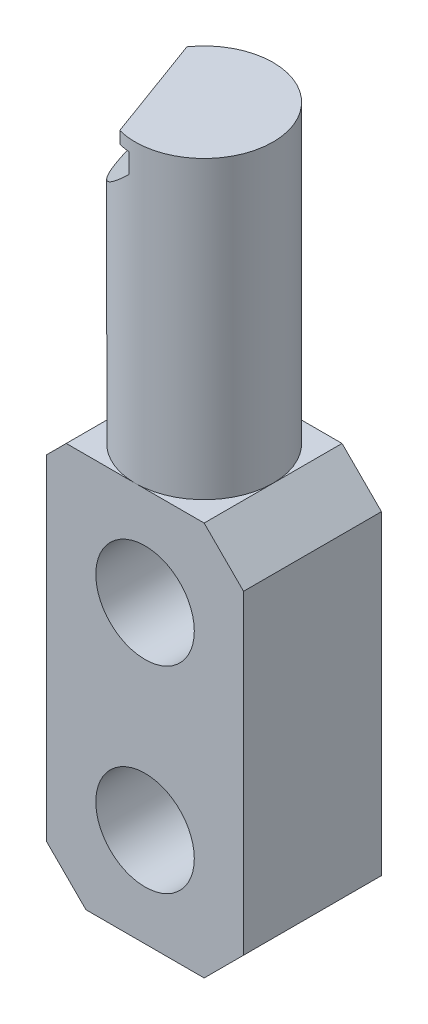
ISO-10303-21;
HEADER;
FILE_DESCRIPTION(('STEP AP214'),'2;1');
FILE_NAME('part.step','',(''),(''),'','','');
FILE_SCHEMA(('AUTOMOTIVE_DESIGN { 1 0 10303 214 1 1 1 1 }'));
ENDSEC;
DATA;
#1=APPLICATION_CONTEXT('core data for automotive mechanical design processes');
#2=APPLICATION_PROTOCOL_DEFINITION('international standard','automotive_design',2000,#1);
#3=PRODUCT_CONTEXT('',#1,'mechanical');
#4=PRODUCT('Part','Part','',(#3));
#5=PRODUCT_RELATED_PRODUCT_CATEGORY('part','',(#4));
#6=PRODUCT_DEFINITION_FORMATION('','',#4);
#7=PRODUCT_DEFINITION_CONTEXT('part definition',#1,'design');
#8=PRODUCT_DEFINITION('design','',#6,#7);
#9=PRODUCT_DEFINITION_SHAPE('','',#8);
#10=(LENGTH_UNIT() NAMED_UNIT(*) SI_UNIT(.MILLI.,.METRE.));
#11=(NAMED_UNIT(*) PLANE_ANGLE_UNIT() SI_UNIT($,.RADIAN.));
#12=(NAMED_UNIT(*) SI_UNIT($,.STERADIAN.) SOLID_ANGLE_UNIT());
#13=UNCERTAINTY_MEASURE_WITH_UNIT(LENGTH_MEASURE(1.E-05),#10,'distance_accuracy_value','');
#14=(GEOMETRIC_REPRESENTATION_CONTEXT(3) GLOBAL_UNCERTAINTY_ASSIGNED_CONTEXT((#13)) GLOBAL_UNIT_ASSIGNED_CONTEXT((#10,
#11,#12)) REPRESENTATION_CONTEXT('',''));
#15=CARTESIAN_POINT('',(0.,0.,0.));
#16=DIRECTION('',(0.,0.,1.));
#17=DIRECTION('',(1.,0.,0.));
#18=AXIS2_PLACEMENT_3D('',#15,#16,#17);
#19=CARTESIAN_POINT('',(0.,20.,7.));
#20=DIRECTION('',(0.,-1.,0.));
#21=DIRECTION('',(1.,0.,0.));
#22=AXIS2_PLACEMENT_3D('',#19,#20,#21);
#23=PLANE('',#22);
#24=DIRECTION('',(-1.,0.,0.));
#25=VECTOR('',#24,1.);
#26=CARTESIAN_POINT('',(0.,20.,0.));
#27=LINE('',#26,#25);
#28=CARTESIAN_POINT('',(4.5,20.,0.));
#29=VERTEX_POINT('',#28);
#30=CARTESIAN_POINT('',(1.00000000000001,20.,0.));
#31=VERTEX_POINT('',#30);
#32=EDGE_CURVE('E214',#29,#31,#27,.T.);
#33=ORIENTED_EDGE('',*,*,#32,.T.);
#34=DIRECTION('',(0.,0.,1.));
#35=VECTOR('',#34,1.);
#36=CARTESIAN_POINT('',(1.00000000000001,20.,7.));
#37=LINE('',#36,#35);
#38=CARTESIAN_POINT('',(1.00000000000001,20.,3.5));
#39=VERTEX_POINT('',#38);
#40=EDGE_CURVE('E47',#31,#39,#37,.T.);
#41=ORIENTED_EDGE('',*,*,#40,.T.);
#42=CARTESIAN_POINT('',(4.5,20.,3.5));
#43=DIRECTION('',(0.,1.,0.));
#44=DIRECTION('',(-1.,0.,0.));
#45=AXIS2_PLACEMENT_3D('',#42,#43,#44);
#46=CIRCLE('',#45,3.5);
#47=EDGE_CURVE('E193',#29,#39,#46,.T.);
#48=ORIENTED_EDGE('',*,*,#47,.F.);
#49=EDGE_LOOP('',(#33,#41,#48));
#50=FACE_BOUND('',#49,.T.);
#51=ADVANCED_FACE('F39',(#50),#23,.F.);
#52=DIRECTION('',(-1.,0.,0.));
#53=VECTOR('',#52,1.);
#54=CARTESIAN_POINT('',(0.,20.,7.));
#55=LINE('',#54,#53);
#56=CARTESIAN_POINT('',(8.,20.,7.));
#57=VERTEX_POINT('',#56);
#58=CARTESIAN_POINT('',(4.5,20.,7.));
#59=VERTEX_POINT('',#58);
#60=EDGE_CURVE('E204',#57,#59,#55,.T.);
#61=ORIENTED_EDGE('',*,*,#60,.F.);
#62=DIRECTION('',(0.,0.,-1.));
#63=VECTOR('',#62,1.);
#64=CARTESIAN_POINT('',(8.,20.,7.));
#65=LINE('',#64,#63);
#66=CARTESIAN_POINT('',(8.,20.,3.5));
#67=VERTEX_POINT('',#66);
#68=EDGE_CURVE('E252',#57,#67,#65,.T.);
#69=ORIENTED_EDGE('',*,*,#68,.T.);
#70=EDGE_CURVE('E189',#59,#67,#46,.T.);
#71=ORIENTED_EDGE('',*,*,#70,.F.);
#72=EDGE_LOOP('',(#61,#69,#71));
#73=FACE_BOUND('',#72,.T.);
#74=ADVANCED_FACE('F301',(#73),#23,.F.);
#75=CARTESIAN_POINT('',(4.5,35.,3.5));
#76=DIRECTION('',(0.,-1.,0.));
#77=DIRECTION('',(1.,0.,0.));
#78=AXIS2_PLACEMENT_3D('',#75,#76,#77);
#79=CYLINDRICAL_SURFACE('',#78,3.5);
#80=ORIENTED_EDGE('',*,*,#70,.T.);
#81=EDGE_CURVE('E184',#67,#29,#46,.T.);
#82=ORIENTED_EDGE('',*,*,#81,.T.);
#83=ORIENTED_EDGE('',*,*,#47,.T.);
#84=EDGE_CURVE('E192',#39,#59,#46,.T.);
#85=ORIENTED_EDGE('',*,*,#84,.T.);
#86=EDGE_LOOP('',(#80,#82,#83,#85));
#87=FACE_BOUND('',#86,.T.);
#88=CARTESIAN_POINT('',(4.5,35.0192767521373,3.5));
#89=DIRECTION('',(-0.686678363662965,0.681998360062494,0.251696368168514));
#90=DIRECTION('',(-0.640337933440032,-0.731353701619174,0.234710660443196));
#91=AXIS2_PLACEMENT_3D('',#88,#89,#90);
#92=ELLIPSE('',#91,5.13197714973872,3.5);
#93=CARTESIAN_POINT('',(1.99557656692745,33.4,1.05503307427748));
#94=VERTEX_POINT('',#93);
#95=CARTESIAN_POINT('',(4.16890259866514,33.4,6.98430402101041));
#96=VERTEX_POINT('',#95);
#97=EDGE_CURVE('E219',#94,#96,#92,.T.);
#98=ORIENTED_EDGE('',*,*,#97,.F.);
#99=DIRECTION('',(0.,-1.,0.));
#100=VECTOR('',#99,1.);
#101=CARTESIAN_POINT('',(1.99557656692745,35.,1.05503307427747));
#102=LINE('',#101,#100);
#103=CARTESIAN_POINT('',(1.99557656692745,34.4,1.05503307427747));
#104=VERTEX_POINT('',#103);
#105=EDGE_CURVE('E221',#104,#94,#102,.T.);
#106=ORIENTED_EDGE('',*,*,#105,.F.);
#107=CARTESIAN_POINT('',(4.5,34.4,3.5));
#108=DIRECTION('',(0.,-1.,0.));
#109=DIRECTION('',(0.,0.,-1.));
#110=AXIS2_PLACEMENT_3D('',#107,#108,#109);
#111=CIRCLE('',#110,3.5);
#112=CARTESIAN_POINT('',(1.62668825833074,34.4,1.50148063927678));
#113=VERTEX_POINT('',#112);
#114=EDGE_CURVE('E155',#113,#104,#111,.T.);
#115=ORIENTED_EDGE('',*,*,#114,.F.);
#116=DIRECTION('',(0.,-1.,0.));
#117=VECTOR('',#116,1.);
#118=CARTESIAN_POINT('',(1.62668825833074,35.,1.50148063927678));
#119=LINE('',#118,#117);
#120=CARTESIAN_POINT('',(1.62668825833074,35.,1.50148063927678));
#121=VERTEX_POINT('',#120);
#122=EDGE_CURVE('E161',#121,#113,#119,.T.);
#123=ORIENTED_EDGE('',*,*,#122,.F.);
#124=CARTESIAN_POINT('',(4.5,35.,3.5));
#125=DIRECTION('',(0.,1.,0.));
#126=DIRECTION('',(-1.,0.,0.));
#127=AXIS2_PLACEMENT_3D('',#124,#125,#126);
#128=CIRCLE('',#127,3.5);
#129=CARTESIAN_POINT('',(3.59887672368323,35.,6.88200781206669));
#130=VERTEX_POINT('',#129);
#131=EDGE_CURVE('E166',#130,#121,#128,.T.);
#132=ORIENTED_EDGE('',*,*,#131,.F.);
#133=DIRECTION('',(0.,-1.,0.));
#134=VECTOR('',#133,1.);
#135=CARTESIAN_POINT('',(3.59887672368323,35.,6.88200781206669));
#136=LINE('',#135,#134);
#137=CARTESIAN_POINT('',(3.59887672368323,34.4,6.88200781206669));
#138=VERTEX_POINT('',#137);
#139=EDGE_CURVE('E158',#138,#130,#136,.F.);
#140=ORIENTED_EDGE('',*,*,#139,.F.);
#141=CARTESIAN_POINT('',(4.16890259866514,34.4,6.98430402101041));
#142=VERTEX_POINT('',#141);
#143=EDGE_CURVE('E142',#142,#138,#111,.T.);
#144=ORIENTED_EDGE('',*,*,#143,.F.);
#145=DIRECTION('',(0.,-1.,0.));
#146=VECTOR('',#145,1.);
#147=CARTESIAN_POINT('',(4.16890259866514,35.,6.98430402101041));
#148=LINE('',#147,#146);
#149=EDGE_CURVE('E152',#96,#142,#148,.F.);
#150=ORIENTED_EDGE('',*,*,#149,.F.);
#151=EDGE_LOOP('',(#98,#106,#115,#123,#132,#140,#144,#150));
#152=FACE_BOUND('',#151,.T.);
#153=ADVANCED_FACE('F164',(#87,#152),#79,.T.);
#154=CARTESIAN_POINT('',(4.5,35.,3.5));
#155=DIRECTION('',(0.,1.,0.));
#156=DIRECTION('',(-1.,0.,0.));
#157=AXIS2_PLACEMENT_3D('',#154,#155,#156);
#158=PLANE('',#157);
#159=ORIENTED_EDGE('',*,*,#131,.T.);
#160=DIRECTION('',(0.34415135605559,0.,0.938914183578616));
#161=VECTOR('',#160,1.);
#162=CARTESIAN_POINT('',(2.61278249100699,35.,4.19174422567174));
#163=LINE('',#162,#161);
#164=EDGE_CURVE('E153',#121,#130,#163,.T.);
#165=ORIENTED_EDGE('',*,*,#164,.T.);
#166=EDGE_LOOP('',(#159,#165));
#167=FACE_BOUND('',#166,.T.);
#168=ADVANCED_FACE('F314',(#167),#158,.T.);
#169=ORIENTED_EDGE('',*,*,#81,.F.);
#170=DIRECTION('',(0.,0.,-1.));
#171=VECTOR('',#170,1.);
#172=CARTESIAN_POINT('',(8.,20.,7.));
#173=LINE('',#172,#171);
#174=CARTESIAN_POINT('',(8.,20.,0.));
#175=VERTEX_POINT('',#174);
#176=EDGE_CURVE('E250',#67,#175,#173,.T.);
#177=ORIENTED_EDGE('',*,*,#176,.T.);
#178=EDGE_CURVE('E197',#175,#29,#27,.T.);
#179=ORIENTED_EDGE('',*,*,#178,.T.);
#180=EDGE_LOOP('',(#169,#177,#179));
#181=FACE_BOUND('',#180,.T.);
#182=ADVANCED_FACE('F306',(#181),#23,.F.);
#183=ORIENTED_EDGE('',*,*,#84,.F.);
#184=DIRECTION('',(0.,0.,1.));
#185=VECTOR('',#184,1.);
#186=CARTESIAN_POINT('',(1.00000000000001,20.,7.));
#187=LINE('',#186,#185);
#188=CARTESIAN_POINT('',(1.00000000000001,20.,7.));
#189=VERTEX_POINT('',#188);
#190=EDGE_CURVE('E54',#39,#189,#187,.T.);
#191=ORIENTED_EDGE('',*,*,#190,.T.);
#192=EDGE_CURVE('E203',#59,#189,#55,.T.);
#193=ORIENTED_EDGE('',*,*,#192,.F.);
#194=EDGE_LOOP('',(#183,#191,#193));
#195=FACE_BOUND('',#194,.T.);
#196=ADVANCED_FACE('F304',(#195),#23,.F.);
#197=CARTESIAN_POINT('',(0.,0.,7.));
#198=DIRECTION('',(1.,0.,0.));
#199=DIRECTION('',(0.,0.,-1.));
#200=AXIS2_PLACEMENT_3D('',#197,#198,#199);
#201=PLANE('',#200);
#202=DIRECTION('',(0.,-1.,0.));
#203=VECTOR('',#202,1.);
#204=CARTESIAN_POINT('',(0.,0.,7.));
#205=LINE('',#204,#203);
#206=CARTESIAN_POINT('',(0.,19.,7.));
#207=VERTEX_POINT('',#206);
#208=CARTESIAN_POINT('',(0.,2.00000000000001,7.));
#209=VERTEX_POINT('',#208);
#210=EDGE_CURVE('E194',#207,#209,#205,.T.);
#211=ORIENTED_EDGE('',*,*,#210,.F.);
#212=DIRECTION('',(0.,0.,-1.));
#213=VECTOR('',#212,1.);
#214=CARTESIAN_POINT('',(0.,19.,7.));
#215=LINE('',#214,#213);
#216=CARTESIAN_POINT('',(0.,19.,0.));
#217=VERTEX_POINT('',#216);
#218=EDGE_CURVE('E255',#207,#217,#215,.T.);
#219=ORIENTED_EDGE('',*,*,#218,.T.);
#220=DIRECTION('',(0.,-1.,0.));
#221=VECTOR('',#220,1.);
#222=CARTESIAN_POINT('',(0.,0.,0.));
#223=LINE('',#222,#221);
#224=CARTESIAN_POINT('',(0.,2.00000000000001,0.));
#225=VERTEX_POINT('',#224);
#226=EDGE_CURVE('E188',#217,#225,#223,.T.);
#227=ORIENTED_EDGE('',*,*,#226,.T.);
#228=DIRECTION('',(0.,0.,1.));
#229=VECTOR('',#228,1.);
#230=CARTESIAN_POINT('',(0.,2.00000000000001,7.));
#231=LINE('',#230,#229);
#232=EDGE_CURVE('E236',#225,#209,#231,.T.);
#233=ORIENTED_EDGE('',*,*,#232,.T.);
#234=EDGE_LOOP('',(#211,#219,#227,#233));
#235=FACE_BOUND('',#234,.T.);
#236=ADVANCED_FACE('F273',(#235),#201,.F.);
#237=CARTESIAN_POINT('',(0.,0.,7.));
#238=DIRECTION('',(0.,1.,0.));
#239=DIRECTION('',(0.,0.,1.));
#240=AXIS2_PLACEMENT_3D('',#237,#238,#239);
#241=PLANE('',#240);
#242=DIRECTION('',(1.,0.,0.));
#243=VECTOR('',#242,1.);
#244=CARTESIAN_POINT('',(0.,0.,7.));
#245=LINE('',#244,#243);
#246=CARTESIAN_POINT('',(2.,0.,7.));
#247=VERTEX_POINT('',#246);
#248=CARTESIAN_POINT('',(7.99999999999999,0.,7.));
#249=VERTEX_POINT('',#248);
#250=EDGE_CURVE('E196',#247,#249,#245,.T.);
#251=ORIENTED_EDGE('',*,*,#250,.F.);
#252=DIRECTION('',(0.,0.,-1.));
#253=VECTOR('',#252,1.);
#254=CARTESIAN_POINT('',(2.,0.,7.));
#255=LINE('',#254,#253);
#256=CARTESIAN_POINT('',(2.,0.,0.));
#257=VERTEX_POINT('',#256);
#258=EDGE_CURVE('E226',#247,#257,#255,.T.);
#259=ORIENTED_EDGE('',*,*,#258,.T.);
#260=DIRECTION('',(1.,0.,0.));
#261=VECTOR('',#260,1.);
#262=CARTESIAN_POINT('',(0.,0.,0.));
#263=LINE('',#262,#261);
#264=CARTESIAN_POINT('',(7.99999999999999,0.,0.));
#265=VERTEX_POINT('',#264);
#266=EDGE_CURVE('E208',#257,#265,#263,.T.);
#267=ORIENTED_EDGE('',*,*,#266,.T.);
#268=DIRECTION('',(0.,0.,1.));
#269=VECTOR('',#268,1.);
#270=CARTESIAN_POINT('',(7.99999999999999,0.,7.));
#271=LINE('',#270,#269);
#272=EDGE_CURVE('E224',#265,#249,#271,.T.);
#273=ORIENTED_EDGE('',*,*,#272,.T.);
#274=EDGE_LOOP('',(#251,#259,#267,#273));
#275=FACE_BOUND('',#274,.T.);
#276=ADVANCED_FACE('F282',(#275),#241,.F.);
#277=CARTESIAN_POINT('',(10.,0.,7.));
#278=DIRECTION('',(-1.,0.,0.));
#279=DIRECTION('',(0.,0.,1.));
#280=AXIS2_PLACEMENT_3D('',#277,#278,#279);
#281=PLANE('',#280);
#282=DIRECTION('',(0.,1.,0.));
#283=VECTOR('',#282,1.);
#284=CARTESIAN_POINT('',(10.,0.,7.));
#285=LINE('',#284,#283);
#286=CARTESIAN_POINT('',(10.,2.,7.));
#287=VERTEX_POINT('',#286);
#288=CARTESIAN_POINT('',(10.,18.,7.));
#289=VERTEX_POINT('',#288);
#290=EDGE_CURVE('E200',#287,#289,#285,.T.);
#291=ORIENTED_EDGE('',*,*,#290,.F.);
#292=DIRECTION('',(0.,0.,-1.));
#293=VECTOR('',#292,1.);
#294=CARTESIAN_POINT('',(10.,2.,7.));
#295=LINE('',#294,#293);
#296=CARTESIAN_POINT('',(10.,2.,0.));
#297=VERTEX_POINT('',#296);
#298=EDGE_CURVE('E247',#287,#297,#295,.T.);
#299=ORIENTED_EDGE('',*,*,#298,.T.);
#300=DIRECTION('',(0.,1.,0.));
#301=VECTOR('',#300,1.);
#302=CARTESIAN_POINT('',(10.,0.,0.));
#303=LINE('',#302,#301);
#304=CARTESIAN_POINT('',(10.,18.,0.));
#305=VERTEX_POINT('',#304);
#306=EDGE_CURVE('E211',#297,#305,#303,.T.);
#307=ORIENTED_EDGE('',*,*,#306,.T.);
#308=DIRECTION('',(0.,0.,1.));
#309=VECTOR('',#308,1.);
#310=CARTESIAN_POINT('',(10.,18.,7.));
#311=LINE('',#310,#309);
#312=EDGE_CURVE('E245',#305,#289,#311,.T.);
#313=ORIENTED_EDGE('',*,*,#312,.T.);
#314=EDGE_LOOP('',(#291,#299,#307,#313));
#315=FACE_BOUND('',#314,.T.);
#316=ADVANCED_FACE('F291',(#315),#281,.F.);
#317=CARTESIAN_POINT('',(0.,20.,7.));
#318=DIRECTION('',(0.,0.,-1.));
#319=DIRECTION('',(-1.,0.,0.));
#320=AXIS2_PLACEMENT_3D('',#317,#318,#319);
#321=PLANE('',#320);
#322=CARTESIAN_POINT('',(5.,5.,7.));
#323=DIRECTION('',(0.,0.,1.));
#324=DIRECTION('',(1.,0.,0.));
#325=AXIS2_PLACEMENT_3D('',#322,#323,#324);
#326=CIRCLE('',#325,2.5);
#327=CARTESIAN_POINT('',(7.5,5.,7.));
#328=VERTEX_POINT('',#327);
#329=EDGE_CURVE('E169',#328,#328,#326,.T.);
#330=ORIENTED_EDGE('',*,*,#329,.F.);
#331=EDGE_LOOP('',(#330));
#332=FACE_BOUND('',#331,.T.);
#333=CARTESIAN_POINT('',(5.,15.,7.));
#334=DIRECTION('',(0.,0.,1.));
#335=DIRECTION('',(1.,0.,0.));
#336=AXIS2_PLACEMENT_3D('',#333,#334,#335);
#337=CIRCLE('',#336,2.5);
#338=CARTESIAN_POINT('',(7.5,15.,7.));
#339=VERTEX_POINT('',#338);
#340=EDGE_CURVE('E178',#339,#339,#337,.T.);
#341=ORIENTED_EDGE('',*,*,#340,.F.);
#342=EDGE_LOOP('',(#341));
#343=FACE_BOUND('',#342,.T.);
#344=ORIENTED_EDGE('',*,*,#192,.T.);
#345=DIRECTION('',(0.707106781186549,0.707106781186546,0.));
#346=VECTOR('',#345,1.);
#347=CARTESIAN_POINT('',(0.,19.,7.));
#348=LINE('',#347,#346);
#349=EDGE_CURVE('E11',#189,#207,#348,.F.);
#350=ORIENTED_EDGE('',*,*,#349,.T.);
#351=ORIENTED_EDGE('',*,*,#210,.T.);
#352=DIRECTION('',(-0.707106781186546,0.707106781186549,0.));
#353=VECTOR('',#352,1.);
#354=CARTESIAN_POINT('',(2.,0.,7.));
#355=LINE('',#354,#353);
#356=EDGE_CURVE('E243',#209,#247,#355,.F.);
#357=ORIENTED_EDGE('',*,*,#356,.T.);
#358=ORIENTED_EDGE('',*,*,#250,.T.);
#359=DIRECTION('',(-0.707106781186549,-0.707106781186546,0.));
#360=VECTOR('',#359,1.);
#361=CARTESIAN_POINT('',(10.,2.,7.));
#362=LINE('',#361,#360);
#363=EDGE_CURVE('E241',#249,#287,#362,.F.);
#364=ORIENTED_EDGE('',*,*,#363,.T.);
#365=ORIENTED_EDGE('',*,*,#290,.T.);
#366=DIRECTION('',(0.707106781186546,-0.707106781186549,0.));
#367=VECTOR('',#366,1.);
#368=CARTESIAN_POINT('',(8.,20.,7.));
#369=LINE('',#368,#367);
#370=EDGE_CURVE('E239',#289,#57,#369,.F.);
#371=ORIENTED_EDGE('',*,*,#370,.T.);
#372=ORIENTED_EDGE('',*,*,#60,.T.);
#373=EDGE_LOOP('',(#344,#350,#351,#357,#358,#364,#365,#371,#372));
#374=FACE_BOUND('',#373,.T.);
#375=ADVANCED_FACE('F271',(#332,#343,#374),#321,.F.);
#376=CARTESIAN_POINT('',(0.,20.,0.));
#377=DIRECTION('',(0.,0.,-1.));
#378=DIRECTION('',(-1.,0.,0.));
#379=AXIS2_PLACEMENT_3D('',#376,#377,#378);
#380=PLANE('',#379);
#381=CARTESIAN_POINT('',(5.,5.,0.));
#382=DIRECTION('',(0.,0.,1.));
#383=DIRECTION('',(1.,0.,0.));
#384=AXIS2_PLACEMENT_3D('',#381,#382,#383);
#385=CIRCLE('',#384,2.5);
#386=CARTESIAN_POINT('',(7.5,5.,0.));
#387=VERTEX_POINT('',#386);
#388=EDGE_CURVE('E175',#387,#387,#385,.T.);
#389=ORIENTED_EDGE('',*,*,#388,.T.);
#390=EDGE_LOOP('',(#389));
#391=FACE_BOUND('',#390,.T.);
#392=CARTESIAN_POINT('',(5.,15.,0.));
#393=DIRECTION('',(0.,0.,1.));
#394=DIRECTION('',(1.,0.,0.));
#395=AXIS2_PLACEMENT_3D('',#392,#393,#394);
#396=CIRCLE('',#395,2.5);
#397=CARTESIAN_POINT('',(7.5,15.,0.));
#398=VERTEX_POINT('',#397);
#399=EDGE_CURVE('E181',#398,#398,#396,.T.);
#400=ORIENTED_EDGE('',*,*,#399,.T.);
#401=EDGE_LOOP('',(#400));
#402=FACE_BOUND('',#401,.T.);
#403=ORIENTED_EDGE('',*,*,#226,.F.);
#404=DIRECTION('',(-0.707106781186549,-0.707106781186546,0.));
#405=VECTOR('',#404,1.);
#406=CARTESIAN_POINT('',(0.500000000000002,19.5,0.));
#407=LINE('',#406,#405);
#408=EDGE_CURVE('E258',#217,#31,#407,.F.);
#409=ORIENTED_EDGE('',*,*,#408,.T.);
#410=ORIENTED_EDGE('',*,*,#32,.F.);
#411=ORIENTED_EDGE('',*,*,#178,.F.);
#412=DIRECTION('',(-0.707106781186546,0.707106781186549,0.));
#413=VECTOR('',#412,1.);
#414=CARTESIAN_POINT('',(4.00000000000001,24.,0.));
#415=LINE('',#414,#413);
#416=EDGE_CURVE('E229',#175,#305,#415,.F.);
#417=ORIENTED_EDGE('',*,*,#416,.T.);
#418=ORIENTED_EDGE('',*,*,#306,.F.);
#419=DIRECTION('',(0.707106781186549,0.707106781186546,0.));
#420=VECTOR('',#419,1.);
#421=CARTESIAN_POINT('',(14.,5.99999999999997,0.));
#422=LINE('',#421,#420);
#423=EDGE_CURVE('E231',#297,#265,#422,.F.);
#424=ORIENTED_EDGE('',*,*,#423,.T.);
#425=ORIENTED_EDGE('',*,*,#266,.F.);
#426=DIRECTION('',(0.707106781186546,-0.707106781186549,0.));
#427=VECTOR('',#426,1.);
#428=CARTESIAN_POINT('',(-9.,11.,0.));
#429=LINE('',#428,#427);
#430=EDGE_CURVE('E233',#257,#225,#429,.F.);
#431=ORIENTED_EDGE('',*,*,#430,.T.);
#432=EDGE_LOOP('',(#403,#409,#410,#411,#417,#418,#424,#425,#431));
#433=FACE_BOUND('',#432,.T.);
#434=ADVANCED_FACE('F263',(#391,#402,#433),#380,.T.);
#435=CARTESIAN_POINT('',(5.,15.,0.));
#436=DIRECTION('',(0.,0.,1.));
#437=DIRECTION('',(1.,0.,0.));
#438=AXIS2_PLACEMENT_3D('',#435,#436,#437);
#439=CYLINDRICAL_SURFACE('',#438,2.5);
#440=ORIENTED_EDGE('',*,*,#399,.F.);
#441=EDGE_LOOP('',(#440));
#442=FACE_BOUND('',#441,.T.);
#443=ORIENTED_EDGE('',*,*,#340,.T.);
#444=EDGE_LOOP('',(#443));
#445=FACE_BOUND('',#444,.T.);
#446=ADVANCED_FACE('F397',(#442,#445),#439,.F.);
#447=CARTESIAN_POINT('',(5.,5.,0.));
#448=DIRECTION('',(0.,0.,1.));
#449=DIRECTION('',(1.,0.,0.));
#450=AXIS2_PLACEMENT_3D('',#447,#448,#449);
#451=CYLINDRICAL_SURFACE('',#450,2.5);
#452=ORIENTED_EDGE('',*,*,#388,.F.);
#453=EDGE_LOOP('',(#452));
#454=FACE_BOUND('',#453,.T.);
#455=ORIENTED_EDGE('',*,*,#329,.T.);
#456=EDGE_LOOP('',(#455));
#457=FACE_BOUND('',#456,.T.);
#458=ADVANCED_FACE('F346',(#454,#457),#451,.F.);
#459=CARTESIAN_POINT('',(4.86461050335268,33.4,8.88233524432303));
#460=DIRECTION('',(-0.686678363662965,0.681998360062494,0.251696368168514));
#461=DIRECTION('',(-0.704684806285746,-0.709520488633006,0.));
#462=AXIS2_PLACEMENT_3D('',#459,#460,#461);
#463=PLANE('',#462);
#464=ORIENTED_EDGE('',*,*,#97,.T.);
#465=DIRECTION('',(-0.34415135605559,0.,-0.938914183578616));
#466=VECTOR('',#465,1.);
#467=CARTESIAN_POINT('',(4.86461050335268,33.4,8.88233524432303));
#468=LINE('',#467,#466);
#469=EDGE_CURVE('E167',#96,#94,#468,.T.);
#470=ORIENTED_EDGE('',*,*,#469,.T.);
#471=EDGE_LOOP('',(#464,#470));
#472=FACE_BOUND('',#471,.T.);
#473=ADVANCED_FACE('F340',(#472),#463,.T.);
#474=CARTESIAN_POINT('',(4.86461050335268,34.4,8.88233524432303));
#475=DIRECTION('',(-0.938914183578616,0.,0.34415135605559));
#476=DIRECTION('',(0.34415135605559,0.,0.938914183578616));
#477=AXIS2_PLACEMENT_3D('',#474,#475,#476);
#478=PLANE('',#477);
#479=ORIENTED_EDGE('',*,*,#105,.T.);
#480=ORIENTED_EDGE('',*,*,#469,.F.);
#481=ORIENTED_EDGE('',*,*,#149,.T.);
#482=DIRECTION('',(-0.34415135605559,0.,-0.938914183578616));
#483=VECTOR('',#482,1.);
#484=CARTESIAN_POINT('',(4.86461050335268,34.4,8.88233524432303));
#485=LINE('',#484,#483);
#486=EDGE_CURVE('E148',#142,#104,#485,.T.);
#487=ORIENTED_EDGE('',*,*,#486,.T.);
#488=EDGE_LOOP('',(#479,#480,#481,#487));
#489=FACE_BOUND('',#488,.T.);
#490=ADVANCED_FACE('F345',(#489),#478,.T.);
#491=CARTESIAN_POINT('',(4.39515341156338,34.4,9.05441092235083));
#492=DIRECTION('',(0.,-1.,0.));
#493=DIRECTION('',(0.,0.,-1.));
#494=AXIS2_PLACEMENT_3D('',#491,#492,#493);
#495=PLANE('',#494);
#496=ORIENTED_EDGE('',*,*,#143,.T.);
#497=DIRECTION('',(-0.34415135605559,0.,-0.938914183578616));
#498=VECTOR('',#497,1.);
#499=CARTESIAN_POINT('',(4.39515341156338,34.4,9.05441092235083));
#500=LINE('',#499,#498);
#501=EDGE_CURVE('E145',#138,#113,#500,.T.);
#502=ORIENTED_EDGE('',*,*,#501,.T.);
#503=ORIENTED_EDGE('',*,*,#114,.T.);
#504=ORIENTED_EDGE('',*,*,#486,.F.);
#505=EDGE_LOOP('',(#496,#502,#503,#504));
#506=FACE_BOUND('',#505,.T.);
#507=ADVANCED_FACE('F144',(#506),#495,.T.);
#508=CARTESIAN_POINT('',(4.39515341156338,35.,9.05441092235083));
#509=DIRECTION('',(-0.938914183578616,0.,0.34415135605559));
#510=DIRECTION('',(0.34415135605559,0.,0.938914183578616));
#511=AXIS2_PLACEMENT_3D('',#508,#509,#510);
#512=PLANE('',#511);
#513=ORIENTED_EDGE('',*,*,#122,.T.);
#514=ORIENTED_EDGE('',*,*,#501,.F.);
#515=ORIENTED_EDGE('',*,*,#139,.T.);
#516=ORIENTED_EDGE('',*,*,#164,.F.);
#517=EDGE_LOOP('',(#513,#514,#515,#516));
#518=FACE_BOUND('',#517,.T.);
#519=ADVANCED_FACE('F157',(#518),#512,.T.);
#520=CARTESIAN_POINT('',(2.,0.,7.));
#521=DIRECTION('',(0.707106781186549,0.707106781186546,0.));
#522=DIRECTION('',(-0.707106781186546,0.707106781186549,0.));
#523=AXIS2_PLACEMENT_3D('',#520,#521,#522);
#524=PLANE('',#523);
#525=ORIENTED_EDGE('',*,*,#356,.F.);
#526=ORIENTED_EDGE('',*,*,#232,.F.);
#527=ORIENTED_EDGE('',*,*,#430,.F.);
#528=ORIENTED_EDGE('',*,*,#258,.F.);
#529=EDGE_LOOP('',(#525,#526,#527,#528));
#530=FACE_BOUND('',#529,.T.);
#531=ADVANCED_FACE('F278',(#530),#524,.F.);
#532=CARTESIAN_POINT('',(10.,2.,7.));
#533=DIRECTION('',(-0.707106781186546,0.707106781186549,0.));
#534=DIRECTION('',(-0.707106781186549,-0.707106781186546,0.));
#535=AXIS2_PLACEMENT_3D('',#532,#533,#534);
#536=PLANE('',#535);
#537=ORIENTED_EDGE('',*,*,#363,.F.);
#538=ORIENTED_EDGE('',*,*,#272,.F.);
#539=ORIENTED_EDGE('',*,*,#423,.F.);
#540=ORIENTED_EDGE('',*,*,#298,.F.);
#541=EDGE_LOOP('',(#537,#538,#539,#540));
#542=FACE_BOUND('',#541,.T.);
#543=ADVANCED_FACE('F286',(#542),#536,.F.);
#544=CARTESIAN_POINT('',(8.,20.,7.));
#545=DIRECTION('',(-0.707106781186549,-0.707106781186546,0.));
#546=DIRECTION('',(0.707106781186546,-0.707106781186549,0.));
#547=AXIS2_PLACEMENT_3D('',#544,#545,#546);
#548=PLANE('',#547);
#549=ORIENTED_EDGE('',*,*,#370,.F.);
#550=ORIENTED_EDGE('',*,*,#312,.F.);
#551=ORIENTED_EDGE('',*,*,#416,.F.);
#552=ORIENTED_EDGE('',*,*,#176,.F.);
#553=ORIENTED_EDGE('',*,*,#68,.F.);
#554=EDGE_LOOP('',(#549,#550,#551,#552,#553));
#555=FACE_BOUND('',#554,.T.);
#556=ADVANCED_FACE('F296',(#555),#548,.F.);
#557=CARTESIAN_POINT('',(0.,19.,7.));
#558=DIRECTION('',(0.707106781186546,-0.707106781186549,0.));
#559=DIRECTION('',(0.707106781186549,0.707106781186546,0.));
#560=AXIS2_PLACEMENT_3D('',#557,#558,#559);
#561=PLANE('',#560);
#562=ORIENTED_EDGE('',*,*,#190,.F.);
#563=ORIENTED_EDGE('',*,*,#40,.F.);
#564=ORIENTED_EDGE('',*,*,#408,.F.);
#565=ORIENTED_EDGE('',*,*,#218,.F.);
#566=ORIENTED_EDGE('',*,*,#349,.F.);
#567=EDGE_LOOP('',(#562,#563,#564,#565,#566));
#568=FACE_BOUND('',#567,.T.);
#569=ADVANCED_FACE('F41',(#568),#561,.F.);
#570=CLOSED_SHELL('',(#51,#74,#153,#168,#182,#196,#236,#276,#316,#375,#434,#446,#458,#473,#490,
#507,#519,#531,#543,#556,#569));
#571=MANIFOLD_SOLID_BREP('B2',#570);
#572=ADVANCED_BREP_SHAPE_REPRESENTATION('',(#18,#571),#14);
#573=SHAPE_DEFINITION_REPRESENTATION(#9,#572);
ENDSEC;
END-ISO-10303-21;
